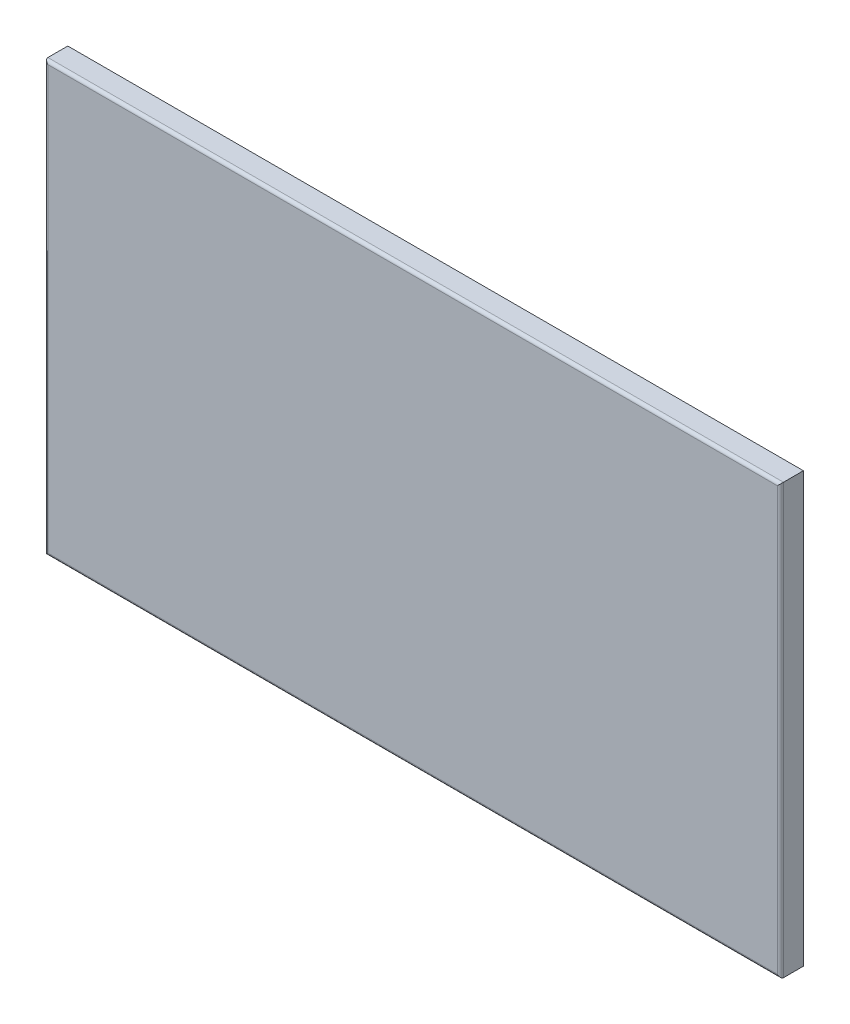
ISO-10303-21;
HEADER;
FILE_DESCRIPTION(('STEP AP214'),'2;1');
FILE_NAME('part.step','',(''),(''),'','','');
FILE_SCHEMA(('AUTOMOTIVE_DESIGN { 1 0 10303 214 1 1 1 1 }'));
ENDSEC;
DATA;
#1=APPLICATION_CONTEXT('core data for automotive mechanical design processes');
#2=APPLICATION_PROTOCOL_DEFINITION('international standard','automotive_design',2000,#1);
#3=PRODUCT_CONTEXT('',#1,'mechanical');
#4=PRODUCT('Part','Part','',(#3));
#5=PRODUCT_RELATED_PRODUCT_CATEGORY('part','',(#4));
#6=PRODUCT_DEFINITION_FORMATION('','',#4);
#7=PRODUCT_DEFINITION_CONTEXT('part definition',#1,'design');
#8=PRODUCT_DEFINITION('design','',#6,#7);
#9=PRODUCT_DEFINITION_SHAPE('','',#8);
#10=(LENGTH_UNIT() NAMED_UNIT(*) SI_UNIT(.MILLI.,.METRE.));
#11=(NAMED_UNIT(*) PLANE_ANGLE_UNIT() SI_UNIT($,.RADIAN.));
#12=(NAMED_UNIT(*) SI_UNIT($,.STERADIAN.) SOLID_ANGLE_UNIT());
#13=UNCERTAINTY_MEASURE_WITH_UNIT(LENGTH_MEASURE(1.E-05),#10,'distance_accuracy_value','');
#14=(GEOMETRIC_REPRESENTATION_CONTEXT(3) GLOBAL_UNCERTAINTY_ASSIGNED_CONTEXT((#13)) GLOBAL_UNIT_ASSIGNED_CONTEXT((#10,
#11,#12)) REPRESENTATION_CONTEXT('',''));
#15=CARTESIAN_POINT('',(0.,0.,0.));
#16=DIRECTION('',(0.,0.,1.));
#17=DIRECTION('',(1.,0.,0.));
#18=AXIS2_PLACEMENT_3D('',#15,#16,#17);
#19=CARTESIAN_POINT('',(304.8,-177.8,2.54));
#20=DIRECTION('',(-1.,0.,0.));
#21=DIRECTION('',(0.,0.,1.));
#22=AXIS2_PLACEMENT_3D('',#19,#20,#21);
#23=PLANE('',#22);
#24=DIRECTION('',(0.,0.,-1.));
#25=VECTOR('',#24,1.);
#26=CARTESIAN_POINT('',(304.8,177.8,2.54));
#27=LINE('',#26,#25);
#28=CARTESIAN_POINT('',(304.8,177.8,0.));
#29=VERTEX_POINT('',#28);
#30=CARTESIAN_POINT('',(304.8,177.8,-16.51));
#31=VERTEX_POINT('',#30);
#32=EDGE_CURVE('E167',#29,#31,#27,.T.);
#33=ORIENTED_EDGE('',*,*,#32,.F.);
#34=DIRECTION('',(0.,1.,0.));
#35=VECTOR('',#34,1.);
#36=CARTESIAN_POINT('',(304.8,-177.8,0.));
#37=LINE('',#36,#35);
#38=CARTESIAN_POINT('',(304.8,-177.8,0.));
#39=VERTEX_POINT('',#38);
#40=EDGE_CURVE('E11',#29,#39,#37,.F.);
#41=ORIENTED_EDGE('',*,*,#40,.T.);
#42=DIRECTION('',(0.,0.,-1.));
#43=VECTOR('',#42,1.);
#44=CARTESIAN_POINT('',(304.8,-177.8,2.54));
#45=LINE('',#44,#43);
#46=CARTESIAN_POINT('',(304.8,-177.8,-16.51));
#47=VERTEX_POINT('',#46);
#48=EDGE_CURVE('E161',#39,#47,#45,.T.);
#49=ORIENTED_EDGE('',*,*,#48,.T.);
#50=DIRECTION('',(0.,1.,0.));
#51=VECTOR('',#50,1.);
#52=CARTESIAN_POINT('',(304.8,-177.8,-16.51));
#53=LINE('',#52,#51);
#54=EDGE_CURVE('E152',#47,#31,#53,.T.);
#55=ORIENTED_EDGE('',*,*,#54,.T.);
#56=EDGE_LOOP('',(#33,#41,#49,#55));
#57=FACE_BOUND('',#56,.T.);
#58=ADVANCED_FACE('F33',(#57),#23,.F.);
#59=CARTESIAN_POINT('',(-304.8,177.8,2.54));
#60=DIRECTION('',(0.,-1.,0.));
#61=DIRECTION('',(0.,0.,-1.));
#62=AXIS2_PLACEMENT_3D('',#59,#60,#61);
#63=PLANE('',#62);
#64=DIRECTION('',(0.,0.,-1.));
#65=VECTOR('',#64,1.);
#66=CARTESIAN_POINT('',(-304.8,177.8,2.54));
#67=LINE('',#66,#65);
#68=CARTESIAN_POINT('',(-304.8,177.8,0.));
#69=VERTEX_POINT('',#68);
#70=CARTESIAN_POINT('',(-304.8,177.8,-16.51));
#71=VERTEX_POINT('',#70);
#72=EDGE_CURVE('E165',#69,#71,#67,.T.);
#73=ORIENTED_EDGE('',*,*,#72,.F.);
#74=DIRECTION('',(-1.,0.,0.));
#75=VECTOR('',#74,1.);
#76=CARTESIAN_POINT('',(-304.8,177.8,0.));
#77=LINE('',#76,#75);
#78=EDGE_CURVE('E42',#69,#29,#77,.F.);
#79=ORIENTED_EDGE('',*,*,#78,.T.);
#80=ORIENTED_EDGE('',*,*,#32,.T.);
#81=DIRECTION('',(-1.,0.,0.));
#82=VECTOR('',#81,1.);
#83=CARTESIAN_POINT('',(304.8,177.8,-16.51));
#84=LINE('',#83,#82);
#85=EDGE_CURVE('E155',#31,#71,#84,.T.);
#86=ORIENTED_EDGE('',*,*,#85,.T.);
#87=EDGE_LOOP('',(#73,#79,#80,#86));
#88=FACE_BOUND('',#87,.T.);
#89=ADVANCED_FACE('F222',(#88),#63,.F.);
#90=CARTESIAN_POINT('',(-304.8,-177.8,2.54));
#91=DIRECTION('',(1.,0.,0.));
#92=DIRECTION('',(0.,0.,-1.));
#93=AXIS2_PLACEMENT_3D('',#90,#91,#92);
#94=PLANE('',#93);
#95=DIRECTION('',(0.,0.,-1.));
#96=VECTOR('',#95,1.);
#97=CARTESIAN_POINT('',(-304.8,-177.8,2.54));
#98=LINE('',#97,#96);
#99=CARTESIAN_POINT('',(-304.8,-177.8,0.));
#100=VERTEX_POINT('',#99);
#101=CARTESIAN_POINT('',(-304.8,-177.8,-16.51));
#102=VERTEX_POINT('',#101);
#103=EDGE_CURVE('E163',#100,#102,#98,.T.);
#104=ORIENTED_EDGE('',*,*,#103,.F.);
#105=DIRECTION('',(0.,-1.,0.));
#106=VECTOR('',#105,1.);
#107=CARTESIAN_POINT('',(-304.8,-177.8,0.));
#108=LINE('',#107,#106);
#109=EDGE_CURVE('E57',#100,#69,#108,.F.);
#110=ORIENTED_EDGE('',*,*,#109,.T.);
#111=ORIENTED_EDGE('',*,*,#72,.T.);
#112=DIRECTION('',(0.,-1.,0.));
#113=VECTOR('',#112,1.);
#114=CARTESIAN_POINT('',(-304.8,177.8,-16.51));
#115=LINE('',#114,#113);
#116=EDGE_CURVE('E158',#71,#102,#115,.T.);
#117=ORIENTED_EDGE('',*,*,#116,.T.);
#118=EDGE_LOOP('',(#104,#110,#111,#117));
#119=FACE_BOUND('',#118,.T.);
#120=ADVANCED_FACE('F217',(#119),#94,.F.);
#121=CARTESIAN_POINT('',(-304.8,-177.8,2.54));
#122=DIRECTION('',(0.,1.,0.));
#123=DIRECTION('',(0.,0.,1.));
#124=AXIS2_PLACEMENT_3D('',#121,#122,#123);
#125=PLANE('',#124);
#126=ORIENTED_EDGE('',*,*,#48,.F.);
#127=DIRECTION('',(1.,0.,0.));
#128=VECTOR('',#127,1.);
#129=CARTESIAN_POINT('',(-304.8,-177.8,0.));
#130=LINE('',#129,#128);
#131=EDGE_CURVE('E187',#39,#100,#130,.F.);
#132=ORIENTED_EDGE('',*,*,#131,.T.);
#133=ORIENTED_EDGE('',*,*,#103,.T.);
#134=DIRECTION('',(1.,0.,0.));
#135=VECTOR('',#134,1.);
#136=CARTESIAN_POINT('',(-304.8,-177.8,-16.51));
#137=LINE('',#136,#135);
#138=EDGE_CURVE('E145',#102,#47,#137,.T.);
#139=ORIENTED_EDGE('',*,*,#138,.T.);
#140=EDGE_LOOP('',(#126,#132,#133,#139));
#141=FACE_BOUND('',#140,.T.);
#142=ADVANCED_FACE('F215',(#141),#125,.F.);
#143=CARTESIAN_POINT('',(0.,0.,2.54));
#144=DIRECTION('',(0.,0.,-1.));
#145=DIRECTION('',(-1.,0.,0.));
#146=AXIS2_PLACEMENT_3D('',#143,#144,#145);
#147=PLANE('',#146);
#148=DIRECTION('',(0.,-1.,0.));
#149=VECTOR('',#148,1.);
#150=CARTESIAN_POINT('',(-302.26,0.,2.54));
#151=LINE('',#150,#149);
#152=CARTESIAN_POINT('',(-302.26,175.26,2.54));
#153=VERTEX_POINT('',#152);
#154=CARTESIAN_POINT('',(-302.26,-175.26,2.54));
#155=VERTEX_POINT('',#154);
#156=EDGE_CURVE('E182',#153,#155,#151,.T.);
#157=ORIENTED_EDGE('',*,*,#156,.T.);
#158=DIRECTION('',(1.,0.,0.));
#159=VECTOR('',#158,1.);
#160=CARTESIAN_POINT('',(0.,-175.26,2.54));
#161=LINE('',#160,#159);
#162=CARTESIAN_POINT('',(302.26,-175.26,2.54));
#163=VERTEX_POINT('',#162);
#164=EDGE_CURVE('E184',#155,#163,#161,.T.);
#165=ORIENTED_EDGE('',*,*,#164,.T.);
#166=DIRECTION('',(0.,1.,0.));
#167=VECTOR('',#166,1.);
#168=CARTESIAN_POINT('',(302.26,0.,2.54));
#169=LINE('',#168,#167);
#170=CARTESIAN_POINT('',(302.26,175.26,2.54));
#171=VERTEX_POINT('',#170);
#172=EDGE_CURVE('E178',#163,#171,#169,.T.);
#173=ORIENTED_EDGE('',*,*,#172,.T.);
#174=DIRECTION('',(-1.,0.,0.));
#175=VECTOR('',#174,1.);
#176=CARTESIAN_POINT('',(0.,175.26,2.54));
#177=LINE('',#176,#175);
#178=EDGE_CURVE('E180',#171,#153,#177,.T.);
#179=ORIENTED_EDGE('',*,*,#178,.T.);
#180=EDGE_LOOP('',(#157,#165,#173,#179));
#181=FACE_BOUND('',#180,.T.);
#182=ADVANCED_FACE('F207',(#181),#147,.F.);
#183=CARTESIAN_POINT('',(0.,0.,-16.51));
#184=DIRECTION('',(0.,0.,1.));
#185=DIRECTION('',(1.,0.,0.));
#186=AXIS2_PLACEMENT_3D('',#183,#184,#185);
#187=PLANE('',#186);
#188=DIRECTION('',(1.,0.,0.));
#189=VECTOR('',#188,1.);
#190=CARTESIAN_POINT('',(-302.26,-175.26,-16.51));
#191=LINE('',#190,#189);
#192=CARTESIAN_POINT('',(-302.26,-175.26,-16.51));
#193=VERTEX_POINT('',#192);
#194=CARTESIAN_POINT('',(302.26,-175.26,-16.51));
#195=VERTEX_POINT('',#194);
#196=EDGE_CURVE('E123',#193,#195,#191,.T.);
#197=ORIENTED_EDGE('',*,*,#196,.T.);
#198=DIRECTION('',(0.,1.,0.));
#199=VECTOR('',#198,1.);
#200=CARTESIAN_POINT('',(302.26,-175.26,-16.51));
#201=LINE('',#200,#199);
#202=CARTESIAN_POINT('',(302.26,175.26,-16.51));
#203=VERTEX_POINT('',#202);
#204=EDGE_CURVE('E116',#195,#203,#201,.T.);
#205=ORIENTED_EDGE('',*,*,#204,.T.);
#206=DIRECTION('',(-1.,0.,0.));
#207=VECTOR('',#206,1.);
#208=CARTESIAN_POINT('',(302.26,175.26,-16.51));
#209=LINE('',#208,#207);
#210=CARTESIAN_POINT('',(-302.26,175.26,-16.51));
#211=VERTEX_POINT('',#210);
#212=EDGE_CURVE('E127',#203,#211,#209,.T.);
#213=ORIENTED_EDGE('',*,*,#212,.T.);
#214=DIRECTION('',(0.,-1.,0.));
#215=VECTOR('',#214,1.);
#216=CARTESIAN_POINT('',(-302.26,175.26,-16.51));
#217=LINE('',#216,#215);
#218=EDGE_CURVE('E132',#211,#193,#217,.T.);
#219=ORIENTED_EDGE('',*,*,#218,.T.);
#220=EDGE_LOOP('',(#197,#205,#213,#219));
#221=FACE_BOUND('',#220,.T.);
#222=ORIENTED_EDGE('',*,*,#138,.F.);
#223=ORIENTED_EDGE('',*,*,#116,.F.);
#224=ORIENTED_EDGE('',*,*,#85,.F.);
#225=ORIENTED_EDGE('',*,*,#54,.F.);
#226=EDGE_LOOP('',(#222,#223,#224,#225));
#227=FACE_BOUND('',#226,.T.);
#228=ADVANCED_FACE('F134',(#221,#227),#187,.F.);
#229=CARTESIAN_POINT('',(302.26,-175.26,-16.51));
#230=DIRECTION('',(1.,0.,0.));
#231=DIRECTION('',(0.,0.,-1.));
#232=AXIS2_PLACEMENT_3D('',#229,#230,#231);
#233=PLANE('',#232);
#234=DIRECTION('',(0.,-1.,0.));
#235=VECTOR('',#234,1.);
#236=CARTESIAN_POINT('',(302.26,0.,0.));
#237=LINE('',#236,#235);
#238=CARTESIAN_POINT('',(302.26,175.26,0.));
#239=VERTEX_POINT('',#238);
#240=CARTESIAN_POINT('',(302.26,-175.26,0.));
#241=VERTEX_POINT('',#240);
#242=EDGE_CURVE('E119',#239,#241,#237,.T.);
#243=ORIENTED_EDGE('',*,*,#242,.F.);
#244=DIRECTION('',(0.,0.,1.));
#245=VECTOR('',#244,1.);
#246=CARTESIAN_POINT('',(302.26,175.26,-16.51));
#247=LINE('',#246,#245);
#248=EDGE_CURVE('E111',#203,#239,#247,.T.);
#249=ORIENTED_EDGE('',*,*,#248,.F.);
#250=ORIENTED_EDGE('',*,*,#204,.F.);
#251=DIRECTION('',(0.,0.,1.));
#252=VECTOR('',#251,1.);
#253=CARTESIAN_POINT('',(302.26,-175.26,-16.51));
#254=LINE('',#253,#252);
#255=EDGE_CURVE('E143',#195,#241,#254,.T.);
#256=ORIENTED_EDGE('',*,*,#255,.T.);
#257=EDGE_LOOP('',(#243,#249,#250,#256));
#258=FACE_BOUND('',#257,.T.);
#259=ADVANCED_FACE('F113',(#258),#233,.F.);
#260=CARTESIAN_POINT('',(-302.26,-175.26,-16.51));
#261=DIRECTION('',(0.,-1.,0.));
#262=DIRECTION('',(0.,0.,-1.));
#263=AXIS2_PLACEMENT_3D('',#260,#261,#262);
#264=PLANE('',#263);
#265=DIRECTION('',(-1.,0.,0.));
#266=VECTOR('',#265,1.);
#267=CARTESIAN_POINT('',(0.,-175.26,0.));
#268=LINE('',#267,#266);
#269=CARTESIAN_POINT('',(-302.26,-175.26,0.));
#270=VERTEX_POINT('',#269);
#271=EDGE_CURVE('E174',#241,#270,#268,.T.);
#272=ORIENTED_EDGE('',*,*,#271,.F.);
#273=ORIENTED_EDGE('',*,*,#255,.F.);
#274=ORIENTED_EDGE('',*,*,#196,.F.);
#275=DIRECTION('',(0.,0.,1.));
#276=VECTOR('',#275,1.);
#277=CARTESIAN_POINT('',(-302.26,-175.26,-16.51));
#278=LINE('',#277,#276);
#279=EDGE_CURVE('E146',#193,#270,#278,.T.);
#280=ORIENTED_EDGE('',*,*,#279,.T.);
#281=EDGE_LOOP('',(#272,#273,#274,#280));
#282=FACE_BOUND('',#281,.T.);
#283=ADVANCED_FACE('F265',(#282),#264,.F.);
#284=CARTESIAN_POINT('',(-302.26,175.26,-16.51));
#285=DIRECTION('',(-1.,0.,0.));
#286=DIRECTION('',(0.,0.,1.));
#287=AXIS2_PLACEMENT_3D('',#284,#285,#286);
#288=PLANE('',#287);
#289=DIRECTION('',(0.,1.,0.));
#290=VECTOR('',#289,1.);
#291=CARTESIAN_POINT('',(-302.26,0.,0.));
#292=LINE('',#291,#290);
#293=CARTESIAN_POINT('',(-302.26,175.26,0.));
#294=VERTEX_POINT('',#293);
#295=EDGE_CURVE('E171',#270,#294,#292,.T.);
#296=ORIENTED_EDGE('',*,*,#295,.F.);
#297=ORIENTED_EDGE('',*,*,#279,.F.);
#298=ORIENTED_EDGE('',*,*,#218,.F.);
#299=DIRECTION('',(0.,0.,1.));
#300=VECTOR('',#299,1.);
#301=CARTESIAN_POINT('',(-302.26,175.26,-16.51));
#302=LINE('',#301,#300);
#303=EDGE_CURVE('E122',#211,#294,#302,.T.);
#304=ORIENTED_EDGE('',*,*,#303,.T.);
#305=EDGE_LOOP('',(#296,#297,#298,#304));
#306=FACE_BOUND('',#305,.T.);
#307=ADVANCED_FACE('F251',(#306),#288,.F.);
#308=CARTESIAN_POINT('',(302.26,175.26,-16.51));
#309=DIRECTION('',(0.,1.,0.));
#310=DIRECTION('',(0.,0.,1.));
#311=AXIS2_PLACEMENT_3D('',#308,#309,#310);
#312=PLANE('',#311);
#313=DIRECTION('',(1.,0.,0.));
#314=VECTOR('',#313,1.);
#315=CARTESIAN_POINT('',(0.,175.26,0.));
#316=LINE('',#315,#314);
#317=EDGE_CURVE('E169',#294,#239,#316,.T.);
#318=ORIENTED_EDGE('',*,*,#317,.F.);
#319=ORIENTED_EDGE('',*,*,#303,.F.);
#320=ORIENTED_EDGE('',*,*,#212,.F.);
#321=ORIENTED_EDGE('',*,*,#248,.T.);
#322=EDGE_LOOP('',(#318,#319,#320,#321));
#323=FACE_BOUND('',#322,.T.);
#324=ADVANCED_FACE('F128',(#323),#312,.F.);
#325=CARTESIAN_POINT('',(0.,0.,0.));
#326=DIRECTION('',(0.,0.,-1.));
#327=DIRECTION('',(-1.,0.,0.));
#328=AXIS2_PLACEMENT_3D('',#325,#326,#327);
#329=PLANE('',#328);
#330=ORIENTED_EDGE('',*,*,#317,.T.);
#331=ORIENTED_EDGE('',*,*,#242,.T.);
#332=ORIENTED_EDGE('',*,*,#271,.T.);
#333=ORIENTED_EDGE('',*,*,#295,.T.);
#334=EDGE_LOOP('',(#330,#331,#332,#333));
#335=FACE_BOUND('',#334,.T.);
#336=ADVANCED_FACE('F242',(#335),#329,.T.);
#337=CARTESIAN_POINT('',(0.,175.26,0.));
#338=DIRECTION('',(-1.,0.,0.));
#339=DIRECTION('',(0.,0.,1.));
#340=AXIS2_PLACEMENT_3D('',#337,#338,#339);
#341=CYLINDRICAL_SURFACE('',#340,2.54);
#342=CARTESIAN_POINT('',(302.26,175.26,0.));
#343=DIRECTION('',(-0.707106781186547,0.707106781186547,0.));
#344=DIRECTION('',(0.707106781186547,0.707106781186547,0.));
#345=AXIS2_PLACEMENT_3D('',#342,#343,#344);
#346=ELLIPSE('',#345,3.59210244842766,2.54);
#347=EDGE_CURVE('E139',#29,#171,#346,.F.);
#348=ORIENTED_EDGE('',*,*,#347,.F.);
#349=ORIENTED_EDGE('',*,*,#78,.F.);
#350=CARTESIAN_POINT('',(-302.26,175.26,0.));
#351=DIRECTION('',(-0.707106781186547,-0.707106781186547,0.));
#352=DIRECTION('',(-0.707106781186547,0.707106781186547,0.));
#353=AXIS2_PLACEMENT_3D('',#350,#351,#352);
#354=ELLIPSE('',#353,3.59210244842766,2.54);
#355=EDGE_CURVE('E37',#153,#69,#354,.T.);
#356=ORIENTED_EDGE('',*,*,#355,.F.);
#357=ORIENTED_EDGE('',*,*,#178,.F.);
#358=EDGE_LOOP('',(#348,#349,#356,#357));
#359=FACE_BOUND('',#358,.T.);
#360=ADVANCED_FACE('F35',(#359),#341,.T.);
#361=CARTESIAN_POINT('',(-302.26,0.,0.));
#362=DIRECTION('',(0.,-1.,0.));
#363=DIRECTION('',(0.,0.,-1.));
#364=AXIS2_PLACEMENT_3D('',#361,#362,#363);
#365=CYLINDRICAL_SURFACE('',#364,2.54);
#366=ORIENTED_EDGE('',*,*,#355,.T.);
#367=ORIENTED_EDGE('',*,*,#109,.F.);
#368=CARTESIAN_POINT('',(-302.26,-175.26,0.));
#369=DIRECTION('',(0.707106781186547,-0.707106781186547,0.));
#370=DIRECTION('',(-0.707106781186547,-0.707106781186547,0.));
#371=AXIS2_PLACEMENT_3D('',#368,#369,#370);
#372=ELLIPSE('',#371,3.59210244842766,2.54);
#373=EDGE_CURVE('E194',#155,#100,#372,.T.);
#374=ORIENTED_EDGE('',*,*,#373,.F.);
#375=ORIENTED_EDGE('',*,*,#156,.F.);
#376=EDGE_LOOP('',(#366,#367,#374,#375));
#377=FACE_BOUND('',#376,.T.);
#378=ADVANCED_FACE('F236',(#377),#365,.T.);
#379=CARTESIAN_POINT('',(302.26,0.,0.));
#380=DIRECTION('',(0.,1.,0.));
#381=DIRECTION('',(0.,0.,1.));
#382=AXIS2_PLACEMENT_3D('',#379,#380,#381);
#383=CYLINDRICAL_SURFACE('',#382,2.54);
#384=ORIENTED_EDGE('',*,*,#347,.T.);
#385=ORIENTED_EDGE('',*,*,#172,.F.);
#386=CARTESIAN_POINT('',(302.26,-175.26,0.));
#387=DIRECTION('',(0.707106781186547,0.707106781186547,0.));
#388=DIRECTION('',(-0.707106781186547,0.707106781186547,0.));
#389=AXIS2_PLACEMENT_3D('',#386,#387,#388);
#390=ELLIPSE('',#389,3.59210244842766,2.54);
#391=EDGE_CURVE('E192',#39,#163,#390,.F.);
#392=ORIENTED_EDGE('',*,*,#391,.F.);
#393=ORIENTED_EDGE('',*,*,#40,.F.);
#394=EDGE_LOOP('',(#384,#385,#392,#393));
#395=FACE_BOUND('',#394,.T.);
#396=ADVANCED_FACE('F200',(#395),#383,.T.);
#397=CARTESIAN_POINT('',(0.,-175.26,0.));
#398=DIRECTION('',(1.,0.,0.));
#399=DIRECTION('',(0.,0.,-1.));
#400=AXIS2_PLACEMENT_3D('',#397,#398,#399);
#401=CYLINDRICAL_SURFACE('',#400,2.54);
#402=ORIENTED_EDGE('',*,*,#373,.T.);
#403=ORIENTED_EDGE('',*,*,#131,.F.);
#404=ORIENTED_EDGE('',*,*,#391,.T.);
#405=ORIENTED_EDGE('',*,*,#164,.F.);
#406=EDGE_LOOP('',(#402,#403,#404,#405));
#407=FACE_BOUND('',#406,.T.);
#408=ADVANCED_FACE('F211',(#407),#401,.T.);
#409=CLOSED_SHELL('',(#58,#89,#120,#142,#182,#228,#259,#283,#307,#324,#336,#360,#378,#396,#408));
#410=MANIFOLD_SOLID_BREP('B2',#409);
#411=ADVANCED_BREP_SHAPE_REPRESENTATION('',(#18,#410),#14);
#412=SHAPE_DEFINITION_REPRESENTATION(#9,#411);
ENDSEC;
END-ISO-10303-21;
